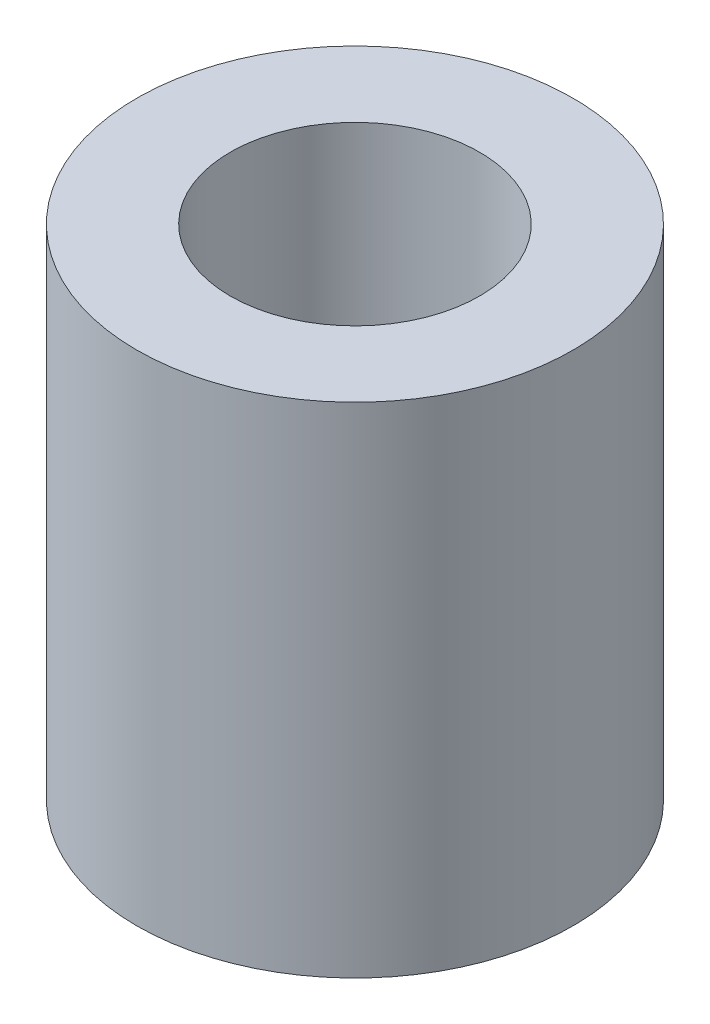
ISO-10303-21;
HEADER;
FILE_DESCRIPTION(('STEP AP214'),'2;1');
FILE_NAME('part.step','',(''),(''),'','','');
FILE_SCHEMA(('AUTOMOTIVE_DESIGN { 1 0 10303 214 1 1 1 1 }'));
ENDSEC;
DATA;
#1=APPLICATION_CONTEXT('core data for automotive mechanical design processes');
#2=APPLICATION_PROTOCOL_DEFINITION('international standard','automotive_design',2000,#1);
#3=PRODUCT_CONTEXT('',#1,'mechanical');
#4=PRODUCT('Part','Part','',(#3));
#5=PRODUCT_RELATED_PRODUCT_CATEGORY('part','',(#4));
#6=PRODUCT_DEFINITION_FORMATION('','',#4);
#7=PRODUCT_DEFINITION_CONTEXT('part definition',#1,'design');
#8=PRODUCT_DEFINITION('design','',#6,#7);
#9=PRODUCT_DEFINITION_SHAPE('','',#8);
#10=(LENGTH_UNIT() NAMED_UNIT(*) SI_UNIT(.MILLI.,.METRE.));
#11=(NAMED_UNIT(*) PLANE_ANGLE_UNIT() SI_UNIT($,.RADIAN.));
#12=(NAMED_UNIT(*) SI_UNIT($,.STERADIAN.) SOLID_ANGLE_UNIT());
#13=UNCERTAINTY_MEASURE_WITH_UNIT(LENGTH_MEASURE(1.E-05),#10,'distance_accuracy_value','');
#14=(GEOMETRIC_REPRESENTATION_CONTEXT(3) GLOBAL_UNCERTAINTY_ASSIGNED_CONTEXT((#13)) GLOBAL_UNIT_ASSIGNED_CONTEXT((#10,
#11,#12)) REPRESENTATION_CONTEXT('',''));
#15=CARTESIAN_POINT('',(0.,0.,0.));
#16=DIRECTION('',(0.,0.,1.));
#17=DIRECTION('',(1.,0.,0.));
#18=AXIS2_PLACEMENT_3D('',#15,#16,#17);
#19=CARTESIAN_POINT('',(0.,6.35,0.));
#20=DIRECTION('',(0.,-1.,0.));
#21=DIRECTION('',(0.,0.,-1.));
#22=AXIS2_PLACEMENT_3D('',#19,#20,#21);
#23=CYLINDRICAL_SURFACE('',#22,2.778125);
#24=CARTESIAN_POINT('',(0.,6.35,0.));
#25=DIRECTION('',(0.,1.,0.));
#26=DIRECTION('',(0.,0.,1.));
#27=AXIS2_PLACEMENT_3D('',#24,#25,#26);
#28=CIRCLE('',#27,2.778125);
#29=CARTESIAN_POINT('',(0.,6.35,2.778125));
#30=VERTEX_POINT('',#29);
#31=EDGE_CURVE('E10',#30,#30,#28,.T.);
#32=ORIENTED_EDGE('',*,*,#31,.F.);
#33=EDGE_LOOP('',(#32));
#34=FACE_BOUND('',#33,.T.);
#35=CARTESIAN_POINT('',(0.,0.,0.));
#36=DIRECTION('',(0.,1.,0.));
#37=DIRECTION('',(0.,0.,1.));
#38=AXIS2_PLACEMENT_3D('',#35,#36,#37);
#39=CIRCLE('',#38,2.778125);
#40=CARTESIAN_POINT('',(0.,0.,2.778125));
#41=VERTEX_POINT('',#40);
#42=EDGE_CURVE('E37',#41,#41,#39,.T.);
#43=ORIENTED_EDGE('',*,*,#42,.T.);
#44=EDGE_LOOP('',(#43));
#45=FACE_BOUND('',#44,.T.);
#46=ADVANCED_FACE('F40',(#34,#45),#23,.T.);
#47=CARTESIAN_POINT('',(0.,6.35,0.));
#48=DIRECTION('',(0.,1.,0.));
#49=DIRECTION('',(0.,0.,1.));
#50=AXIS2_PLACEMENT_3D('',#47,#48,#49);
#51=PLANE('',#50);
#52=CARTESIAN_POINT('',(0.,6.35,0.));
#53=DIRECTION('',(0.,1.,0.));
#54=DIRECTION('',(0.,0.,1.));
#55=AXIS2_PLACEMENT_3D('',#52,#53,#54);
#56=CIRCLE('',#55,1.5875);
#57=CARTESIAN_POINT('',(0.,6.35,1.5875));
#58=VERTEX_POINT('',#57);
#59=EDGE_CURVE('E47',#58,#58,#56,.T.);
#60=ORIENTED_EDGE('',*,*,#59,.F.);
#61=EDGE_LOOP('',(#60));
#62=FACE_BOUND('',#61,.T.);
#63=ORIENTED_EDGE('',*,*,#31,.T.);
#64=EDGE_LOOP('',(#63));
#65=FACE_BOUND('',#64,.T.);
#66=ADVANCED_FACE('F62',(#62,#65),#51,.T.);
#67=CARTESIAN_POINT('',(0.,0.,0.));
#68=DIRECTION('',(0.,1.,0.));
#69=DIRECTION('',(0.,0.,1.));
#70=AXIS2_PLACEMENT_3D('',#67,#68,#69);
#71=PLANE('',#70);
#72=CARTESIAN_POINT('',(0.,0.,0.));
#73=DIRECTION('',(0.,1.,0.));
#74=DIRECTION('',(0.,0.,1.));
#75=AXIS2_PLACEMENT_3D('',#72,#73,#74);
#76=CIRCLE('',#75,1.5875);
#77=CARTESIAN_POINT('',(0.,0.,1.5875));
#78=VERTEX_POINT('',#77);
#79=EDGE_CURVE('E50',#78,#78,#76,.T.);
#80=ORIENTED_EDGE('',*,*,#79,.T.);
#81=EDGE_LOOP('',(#80));
#82=FACE_BOUND('',#81,.T.);
#83=ORIENTED_EDGE('',*,*,#42,.F.);
#84=EDGE_LOOP('',(#83));
#85=FACE_BOUND('',#84,.T.);
#86=ADVANCED_FACE('F54',(#82,#85),#71,.F.);
#87=CARTESIAN_POINT('',(0.,0.,0.));
#88=DIRECTION('',(0.,1.,0.));
#89=DIRECTION('',(0.,0.,1.));
#90=AXIS2_PLACEMENT_3D('',#87,#88,#89);
#91=CYLINDRICAL_SURFACE('',#90,1.5875);
#92=ORIENTED_EDGE('',*,*,#79,.F.);
#93=EDGE_LOOP('',(#92));
#94=FACE_BOUND('',#93,.T.);
#95=ORIENTED_EDGE('',*,*,#59,.T.);
#96=EDGE_LOOP('',(#95));
#97=FACE_BOUND('',#96,.T.);
#98=ADVANCED_FACE('F59',(#94,#97),#91,.F.);
#99=CLOSED_SHELL('',(#46,#66,#86,#98));
#100=MANIFOLD_SOLID_BREP('B2',#99);
#101=ADVANCED_BREP_SHAPE_REPRESENTATION('',(#18,#100),#14);
#102=SHAPE_DEFINITION_REPRESENTATION(#9,#101);
ENDSEC;
END-ISO-10303-21;
